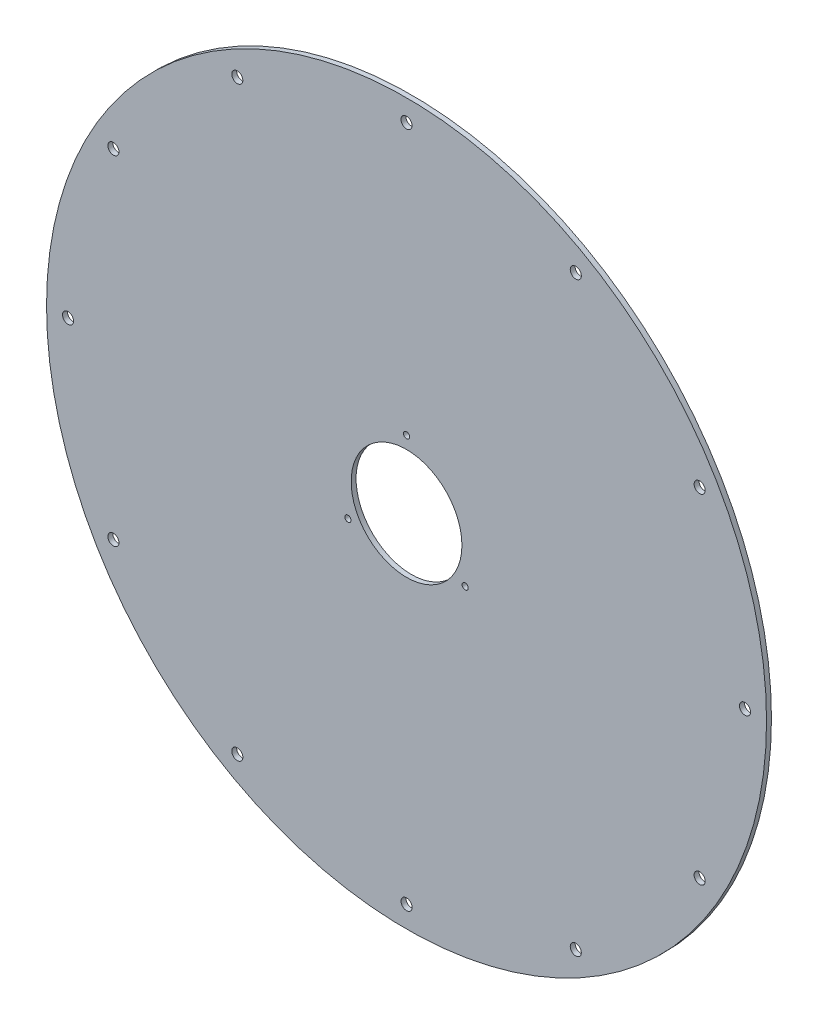
ISO-10303-21;
HEADER;
FILE_DESCRIPTION(('STEP AP214'),'2;1');
FILE_NAME('part.step','',(''),(''),'','','');
FILE_SCHEMA(('AUTOMOTIVE_DESIGN { 1 0 10303 214 1 1 1 1 }'));
ENDSEC;
DATA;
#1=APPLICATION_CONTEXT('core data for automotive mechanical design processes');
#2=APPLICATION_PROTOCOL_DEFINITION('international standard','automotive_design',2000,#1);
#3=PRODUCT_CONTEXT('',#1,'mechanical');
#4=PRODUCT('Part','Part','',(#3));
#5=PRODUCT_RELATED_PRODUCT_CATEGORY('part','',(#4));
#6=PRODUCT_DEFINITION_FORMATION('','',#4);
#7=PRODUCT_DEFINITION_CONTEXT('part definition',#1,'design');
#8=PRODUCT_DEFINITION('design','',#6,#7);
#9=PRODUCT_DEFINITION_SHAPE('','',#8);
#10=(LENGTH_UNIT() NAMED_UNIT(*) SI_UNIT(.MILLI.,.METRE.));
#11=(NAMED_UNIT(*) PLANE_ANGLE_UNIT() SI_UNIT($,.RADIAN.));
#12=(NAMED_UNIT(*) SI_UNIT($,.STERADIAN.) SOLID_ANGLE_UNIT());
#13=UNCERTAINTY_MEASURE_WITH_UNIT(LENGTH_MEASURE(1.E-05),#10,'distance_accuracy_value','');
#14=(GEOMETRIC_REPRESENTATION_CONTEXT(3) GLOBAL_UNCERTAINTY_ASSIGNED_CONTEXT((#13)) GLOBAL_UNIT_ASSIGNED_CONTEXT((#10,
#11,#12)) REPRESENTATION_CONTEXT('',''));
#15=CARTESIAN_POINT('',(0.,0.,0.));
#16=DIRECTION('',(0.,0.,1.));
#17=DIRECTION('',(1.,0.,0.));
#18=AXIS2_PLACEMENT_3D('',#15,#16,#17);
#19=CARTESIAN_POINT('',(0.,0.,0.));
#20=DIRECTION('',(0.,0.,1.));
#21=DIRECTION('',(1.,0.,0.));
#22=AXIS2_PLACEMENT_3D('',#19,#20,#21);
#23=PLANE('',#22);
#24=CARTESIAN_POINT('',(47.6313972081444,-27.4999999999996,0.));
#25=DIRECTION('',(0.,0.,-1.));
#26=DIRECTION('',(-1.,0.,0.));
#27=AXIS2_PLACEMENT_3D('',#24,#25,#26);
#28=CIRCLE('',#27,2.5);
#29=CARTESIAN_POINT('',(45.1313972081444,-27.4999999999996,0.));
#30=VERTEX_POINT('',#29);
#31=EDGE_CURVE('E148',#30,#30,#28,.T.);
#32=ORIENTED_EDGE('',*,*,#31,.F.);
#33=EDGE_LOOP('',(#32));
#34=FACE_BOUND('',#33,.T.);
#35=CARTESIAN_POINT('',(0.,55.,0.));
#36=DIRECTION('',(0.,0.,-1.));
#37=DIRECTION('',(-1.,0.,0.));
#38=AXIS2_PLACEMENT_3D('',#35,#36,#37);
#39=CIRCLE('',#38,2.5);
#40=CARTESIAN_POINT('',(-2.5,55.,0.));
#41=VERTEX_POINT('',#40);
#42=EDGE_CURVE('E136',#41,#41,#39,.T.);
#43=ORIENTED_EDGE('',*,*,#42,.F.);
#44=EDGE_LOOP('',(#43));
#45=FACE_BOUND('',#44,.T.);
#46=CARTESIAN_POINT('',(-238.156986040721,137.499999999999,0.));
#47=DIRECTION('',(0.,0.,1.));
#48=DIRECTION('',(0.499999999999998,0.86602540378444,0.));
#49=AXIS2_PLACEMENT_3D('',#46,#47,#48);
#50=CIRCLE('',#49,4.5);
#51=CARTESIAN_POINT('',(-235.906986040721,141.397114317029,0.));
#52=VERTEX_POINT('',#51);
#53=EDGE_CURVE('E71',#52,#52,#50,.T.);
#54=ORIENTED_EDGE('',*,*,#53,.T.);
#55=EDGE_LOOP('',(#54));
#56=FACE_BOUND('',#55,.T.);
#57=CARTESIAN_POINT('',(-275.,-9.60157368181862E-13,0.));
#58=DIRECTION('',(0.,0.,1.));
#59=DIRECTION('',(0.,1.,0.));
#60=AXIS2_PLACEMENT_3D('',#57,#58,#59);
#61=CIRCLE('',#60,4.5);
#62=CARTESIAN_POINT('',(-275.,4.49999999999904,0.));
#63=VERTEX_POINT('',#62);
#64=EDGE_CURVE('E114',#63,#63,#61,.T.);
#65=ORIENTED_EDGE('',*,*,#64,.T.);
#66=EDGE_LOOP('',(#65));
#67=FACE_BOUND('',#66,.T.);
#68=CARTESIAN_POINT('',(-238.15698604072,-137.500000000001,0.));
#69=DIRECTION('',(0.,0.,1.));
#70=DIRECTION('',(-0.500000000000004,0.866025403784436,0.));
#71=AXIS2_PLACEMENT_3D('',#68,#69,#70);
#72=CIRCLE('',#71,4.5);
#73=CARTESIAN_POINT('',(-240.40698604072,-133.602885682971,0.));
#74=VERTEX_POINT('',#73);
#75=EDGE_CURVE('E108',#74,#74,#72,.T.);
#76=ORIENTED_EDGE('',*,*,#75,.T.);
#77=EDGE_LOOP('',(#76));
#78=FACE_BOUND('',#77,.T.);
#79=CARTESIAN_POINT('',(-137.499999999999,-238.156986040721,0.));
#80=DIRECTION('',(0.,0.,1.));
#81=DIRECTION('',(-0.866025403784442,0.499999999999995,0.));
#82=AXIS2_PLACEMENT_3D('',#79,#80,#81);
#83=CIRCLE('',#82,4.5);
#84=CARTESIAN_POINT('',(-141.397114317029,-235.906986040722,0.));
#85=VERTEX_POINT('',#84);
#86=EDGE_CURVE('E102',#85,#85,#83,.T.);
#87=ORIENTED_EDGE('',*,*,#86,.T.);
#88=EDGE_LOOP('',(#87));
#89=FACE_BOUND('',#88,.T.);
#90=CARTESIAN_POINT('',(0.,-275.,0.));
#91=DIRECTION('',(0.,0.,1.));
#92=DIRECTION('',(-1.,0.,0.));
#93=AXIS2_PLACEMENT_3D('',#90,#91,#92);
#94=CIRCLE('',#93,4.5);
#95=CARTESIAN_POINT('',(-4.5,-275.,0.));
#96=VERTEX_POINT('',#95);
#97=EDGE_CURVE('E96',#96,#96,#94,.T.);
#98=ORIENTED_EDGE('',*,*,#97,.T.);
#99=EDGE_LOOP('',(#98));
#100=FACE_BOUND('',#99,.T.);
#101=CARTESIAN_POINT('',(137.500000000002,-238.15698604072,0.));
#102=DIRECTION('',(0.,0.,1.));
#103=DIRECTION('',(-0.866025403784435,-0.500000000000007,0.));
#104=AXIS2_PLACEMENT_3D('',#101,#102,#103);
#105=CIRCLE('',#104,4.5);
#106=CARTESIAN_POINT('',(133.602885682972,-240.40698604072,0.));
#107=VERTEX_POINT('',#106);
#108=EDGE_CURVE('E90',#107,#107,#105,.T.);
#109=ORIENTED_EDGE('',*,*,#108,.T.);
#110=EDGE_LOOP('',(#109));
#111=FACE_BOUND('',#110,.T.);
#112=CARTESIAN_POINT('',(238.156986040722,-137.499999999998,0.));
#113=DIRECTION('',(0.,0.,1.));
#114=DIRECTION('',(-0.499999999999992,-0.866025403784443,0.));
#115=AXIS2_PLACEMENT_3D('',#112,#113,#114);
#116=CIRCLE('',#115,4.5);
#117=CARTESIAN_POINT('',(235.906986040722,-141.397114317028,0.));
#118=VERTEX_POINT('',#117);
#119=EDGE_CURVE('E84',#118,#118,#116,.T.);
#120=ORIENTED_EDGE('',*,*,#119,.T.);
#121=EDGE_LOOP('',(#120));
#122=FACE_BOUND('',#121,.T.);
#123=CARTESIAN_POINT('',(275.,2.88047210454559E-12,0.));
#124=DIRECTION('',(0.,0.,1.));
#125=DIRECTION('',(0.,-1.,0.));
#126=AXIS2_PLACEMENT_3D('',#123,#124,#125);
#127=CIRCLE('',#126,4.5);
#128=CARTESIAN_POINT('',(275.,-4.49999999999712,0.));
#129=VERTEX_POINT('',#128);
#130=EDGE_CURVE('E77',#129,#129,#127,.T.);
#131=ORIENTED_EDGE('',*,*,#130,.T.);
#132=EDGE_LOOP('',(#131));
#133=FACE_BOUND('',#132,.T.);
#134=CARTESIAN_POINT('',(238.156986040719,137.500000000003,0.));
#135=DIRECTION('',(0.,0.,1.));
#136=DIRECTION('',(0.50000000000001,-0.866025403784433,0.));
#137=AXIS2_PLACEMENT_3D('',#134,#135,#136);
#138=CIRCLE('',#137,4.5);
#139=CARTESIAN_POINT('',(240.406986040719,133.602885682973,0.));
#140=VERTEX_POINT('',#139);
#141=EDGE_CURVE('E78',#140,#140,#138,.T.);
#142=ORIENTED_EDGE('',*,*,#141,.T.);
#143=EDGE_LOOP('',(#142));
#144=FACE_BOUND('',#143,.T.);
#145=CARTESIAN_POINT('',(137.499999999997,238.156986040722,0.));
#146=DIRECTION('',(0.,0.,1.));
#147=DIRECTION('',(0.866025403784445,-0.499999999999989,0.));
#148=AXIS2_PLACEMENT_3D('',#145,#146,#147);
#149=CIRCLE('',#148,4.5);
#150=CARTESIAN_POINT('',(141.397114317027,235.906986040722,0.));
#151=VERTEX_POINT('',#150);
#152=EDGE_CURVE('E125',#151,#151,#149,.T.);
#153=ORIENTED_EDGE('',*,*,#152,.T.);
#154=EDGE_LOOP('',(#153));
#155=FACE_BOUND('',#154,.T.);
#156=CARTESIAN_POINT('',(-137.5,238.15698604072,0.));
#157=DIRECTION('',(0.,0.,1.));
#158=DIRECTION('',(0.866025403784438,0.500000000000001,0.));
#159=AXIS2_PLACEMENT_3D('',#156,#157,#158);
#160=CIRCLE('',#159,4.5);
#161=CARTESIAN_POINT('',(-133.60288568297,240.40698604072,0.));
#162=VERTEX_POINT('',#161);
#163=EDGE_CURVE('E65',#162,#162,#160,.T.);
#164=ORIENTED_EDGE('',*,*,#163,.T.);
#165=EDGE_LOOP('',(#164));
#166=FACE_BOUND('',#165,.T.);
#167=CARTESIAN_POINT('',(0.,275.,0.));
#168=DIRECTION('',(0.,0.,1.));
#169=DIRECTION('',(1.,0.,0.));
#170=AXIS2_PLACEMENT_3D('',#167,#168,#169);
#171=CIRCLE('',#170,4.5);
#172=CARTESIAN_POINT('',(4.5,275.,0.));
#173=VERTEX_POINT('',#172);
#174=EDGE_CURVE('E59',#173,#173,#171,.T.);
#175=ORIENTED_EDGE('',*,*,#174,.T.);
#176=EDGE_LOOP('',(#175));
#177=FACE_BOUND('',#176,.T.);
#178=CARTESIAN_POINT('',(0.,0.,0.));
#179=DIRECTION('',(0.,0.,1.));
#180=DIRECTION('',(1.,0.,0.));
#181=AXIS2_PLACEMENT_3D('',#178,#179,#180);
#182=CIRCLE('',#181,292.5);
#183=CARTESIAN_POINT('',(292.5,0.,0.));
#184=VERTEX_POINT('',#183);
#185=EDGE_CURVE('E47',#184,#184,#182,.T.);
#186=ORIENTED_EDGE('',*,*,#185,.F.);
#187=EDGE_LOOP('',(#186));
#188=FACE_BOUND('',#187,.T.);
#189=CARTESIAN_POINT('',(0.,0.,0.));
#190=DIRECTION('',(0.,0.,1.));
#191=DIRECTION('',(1.,0.,0.));
#192=AXIS2_PLACEMENT_3D('',#189,#190,#191);
#193=CIRCLE('',#192,45.);
#194=CARTESIAN_POINT('',(45.,0.,0.));
#195=VERTEX_POINT('',#194);
#196=EDGE_CURVE('E56',#195,#195,#193,.T.);
#197=ORIENTED_EDGE('',*,*,#196,.T.);
#198=EDGE_LOOP('',(#197));
#199=FACE_BOUND('',#198,.T.);
#200=CARTESIAN_POINT('',(-47.631397208144,-27.5000000000002,0.));
#201=DIRECTION('',(0.,0.,-1.));
#202=DIRECTION('',(-1.,0.,0.));
#203=AXIS2_PLACEMENT_3D('',#200,#201,#202);
#204=CIRCLE('',#203,2.5);
#205=CARTESIAN_POINT('',(-50.131397208144,-27.5000000000002,0.));
#206=VERTEX_POINT('',#205);
#207=EDGE_CURVE('E142',#206,#206,#204,.T.);
#208=ORIENTED_EDGE('',*,*,#207,.F.);
#209=EDGE_LOOP('',(#208));
#210=FACE_BOUND('',#209,.T.);
#211=ADVANCED_FACE('F43',(#34,#45,#56,#67,#78,#89,#100,#111,#122,#133,#144,#155,#166,#177,#188,
#199,#210),#23,.F.);
#212=CARTESIAN_POINT('',(0.,0.,4.));
#213=DIRECTION('',(0.,0.,1.));
#214=DIRECTION('',(1.,0.,0.));
#215=AXIS2_PLACEMENT_3D('',#212,#213,#214);
#216=PLANE('',#215);
#217=CARTESIAN_POINT('',(47.6313972081444,-27.4999999999996,4.));
#218=DIRECTION('',(0.,0.,1.));
#219=DIRECTION('',(1.,0.,0.));
#220=AXIS2_PLACEMENT_3D('',#217,#218,#219);
#221=CIRCLE('',#220,2.5);
#222=CARTESIAN_POINT('',(50.1313972081444,-27.4999999999996,4.));
#223=VERTEX_POINT('',#222);
#224=EDGE_CURVE('E145',#223,#223,#221,.T.);
#225=ORIENTED_EDGE('',*,*,#224,.F.);
#226=EDGE_LOOP('',(#225));
#227=FACE_BOUND('',#226,.T.);
#228=CARTESIAN_POINT('',(-47.631397208144,-27.5000000000002,4.));
#229=DIRECTION('',(0.,0.,1.));
#230=DIRECTION('',(1.,0.,0.));
#231=AXIS2_PLACEMENT_3D('',#228,#229,#230);
#232=CIRCLE('',#231,2.5);
#233=CARTESIAN_POINT('',(-45.131397208144,-27.5000000000002,4.));
#234=VERTEX_POINT('',#233);
#235=EDGE_CURVE('E139',#234,#234,#232,.T.);
#236=ORIENTED_EDGE('',*,*,#235,.F.);
#237=EDGE_LOOP('',(#236));
#238=FACE_BOUND('',#237,.T.);
#239=CARTESIAN_POINT('',(0.,55.,4.));
#240=DIRECTION('',(0.,0.,1.));
#241=DIRECTION('',(1.,0.,0.));
#242=AXIS2_PLACEMENT_3D('',#239,#240,#241);
#243=CIRCLE('',#242,2.5);
#244=CARTESIAN_POINT('',(2.5,55.,4.));
#245=VERTEX_POINT('',#244);
#246=EDGE_CURVE('E126',#245,#245,#243,.T.);
#247=ORIENTED_EDGE('',*,*,#246,.F.);
#248=EDGE_LOOP('',(#247));
#249=FACE_BOUND('',#248,.T.);
#250=CARTESIAN_POINT('',(-238.156986040721,137.499999999999,4.));
#251=DIRECTION('',(0.,0.,1.));
#252=DIRECTION('',(0.499999999999998,0.86602540378444,0.));
#253=AXIS2_PLACEMENT_3D('',#250,#251,#252);
#254=CIRCLE('',#253,4.5);
#255=CARTESIAN_POINT('',(-235.906986040721,141.397114317029,4.));
#256=VERTEX_POINT('',#255);
#257=EDGE_CURVE('E117',#256,#256,#254,.T.);
#258=ORIENTED_EDGE('',*,*,#257,.F.);
#259=EDGE_LOOP('',(#258));
#260=FACE_BOUND('',#259,.T.);
#261=CARTESIAN_POINT('',(-275.,-9.60157368181862E-13,4.));
#262=DIRECTION('',(0.,0.,1.));
#263=DIRECTION('',(0.,1.,0.));
#264=AXIS2_PLACEMENT_3D('',#261,#262,#263);
#265=CIRCLE('',#264,4.5);
#266=CARTESIAN_POINT('',(-275.,4.49999999999904,4.));
#267=VERTEX_POINT('',#266);
#268=EDGE_CURVE('E111',#267,#267,#265,.T.);
#269=ORIENTED_EDGE('',*,*,#268,.F.);
#270=EDGE_LOOP('',(#269));
#271=FACE_BOUND('',#270,.T.);
#272=CARTESIAN_POINT('',(-238.15698604072,-137.500000000001,4.));
#273=DIRECTION('',(0.,0.,1.));
#274=DIRECTION('',(-0.500000000000004,0.866025403784436,0.));
#275=AXIS2_PLACEMENT_3D('',#272,#273,#274);
#276=CIRCLE('',#275,4.5);
#277=CARTESIAN_POINT('',(-240.40698604072,-133.602885682971,4.));
#278=VERTEX_POINT('',#277);
#279=EDGE_CURVE('E105',#278,#278,#276,.T.);
#280=ORIENTED_EDGE('',*,*,#279,.F.);
#281=EDGE_LOOP('',(#280));
#282=FACE_BOUND('',#281,.T.);
#283=CARTESIAN_POINT('',(-137.499999999999,-238.156986040721,4.));
#284=DIRECTION('',(0.,0.,1.));
#285=DIRECTION('',(-0.866025403784442,0.499999999999995,0.));
#286=AXIS2_PLACEMENT_3D('',#283,#284,#285);
#287=CIRCLE('',#286,4.5);
#288=CARTESIAN_POINT('',(-141.397114317029,-235.906986040722,4.));
#289=VERTEX_POINT('',#288);
#290=EDGE_CURVE('E99',#289,#289,#287,.T.);
#291=ORIENTED_EDGE('',*,*,#290,.F.);
#292=EDGE_LOOP('',(#291));
#293=FACE_BOUND('',#292,.T.);
#294=CARTESIAN_POINT('',(0.,-275.,4.));
#295=DIRECTION('',(0.,0.,1.));
#296=DIRECTION('',(-1.,0.,0.));
#297=AXIS2_PLACEMENT_3D('',#294,#295,#296);
#298=CIRCLE('',#297,4.5);
#299=CARTESIAN_POINT('',(-4.5,-275.,4.));
#300=VERTEX_POINT('',#299);
#301=EDGE_CURVE('E93',#300,#300,#298,.T.);
#302=ORIENTED_EDGE('',*,*,#301,.F.);
#303=EDGE_LOOP('',(#302));
#304=FACE_BOUND('',#303,.T.);
#305=CARTESIAN_POINT('',(137.500000000002,-238.15698604072,4.));
#306=DIRECTION('',(0.,0.,1.));
#307=DIRECTION('',(-0.866025403784435,-0.500000000000007,0.));
#308=AXIS2_PLACEMENT_3D('',#305,#306,#307);
#309=CIRCLE('',#308,4.5);
#310=CARTESIAN_POINT('',(133.602885682972,-240.40698604072,4.));
#311=VERTEX_POINT('',#310);
#312=EDGE_CURVE('E87',#311,#311,#309,.T.);
#313=ORIENTED_EDGE('',*,*,#312,.F.);
#314=EDGE_LOOP('',(#313));
#315=FACE_BOUND('',#314,.T.);
#316=CARTESIAN_POINT('',(238.156986040722,-137.499999999998,4.));
#317=DIRECTION('',(0.,0.,1.));
#318=DIRECTION('',(-0.499999999999992,-0.866025403784443,0.));
#319=AXIS2_PLACEMENT_3D('',#316,#317,#318);
#320=CIRCLE('',#319,4.5);
#321=CARTESIAN_POINT('',(235.906986040722,-141.397114317028,4.));
#322=VERTEX_POINT('',#321);
#323=EDGE_CURVE('E81',#322,#322,#320,.T.);
#324=ORIENTED_EDGE('',*,*,#323,.F.);
#325=EDGE_LOOP('',(#324));
#326=FACE_BOUND('',#325,.T.);
#327=CARTESIAN_POINT('',(275.,2.88047210454559E-12,4.));
#328=DIRECTION('',(0.,0.,1.));
#329=DIRECTION('',(0.,-1.,0.));
#330=AXIS2_PLACEMENT_3D('',#327,#328,#329);
#331=CIRCLE('',#330,4.5);
#332=CARTESIAN_POINT('',(275.,-4.49999999999712,4.));
#333=VERTEX_POINT('',#332);
#334=EDGE_CURVE('E74',#333,#333,#331,.T.);
#335=ORIENTED_EDGE('',*,*,#334,.F.);
#336=EDGE_LOOP('',(#335));
#337=FACE_BOUND('',#336,.T.);
#338=CARTESIAN_POINT('',(238.156986040719,137.500000000003,4.));
#339=DIRECTION('',(0.,0.,1.));
#340=DIRECTION('',(0.50000000000001,-0.866025403784433,0.));
#341=AXIS2_PLACEMENT_3D('',#338,#339,#340);
#342=CIRCLE('',#341,4.5);
#343=CARTESIAN_POINT('',(240.406986040719,133.602885682973,4.));
#344=VERTEX_POINT('',#343);
#345=EDGE_CURVE('E129',#344,#344,#342,.T.);
#346=ORIENTED_EDGE('',*,*,#345,.F.);
#347=EDGE_LOOP('',(#346));
#348=FACE_BOUND('',#347,.T.);
#349=CARTESIAN_POINT('',(137.499999999997,238.156986040722,4.));
#350=DIRECTION('',(0.,0.,1.));
#351=DIRECTION('',(0.866025403784445,-0.499999999999989,0.));
#352=AXIS2_PLACEMENT_3D('',#349,#350,#351);
#353=CIRCLE('',#352,4.5);
#354=CARTESIAN_POINT('',(141.397114317027,235.906986040722,4.));
#355=VERTEX_POINT('',#354);
#356=EDGE_CURVE('E122',#355,#355,#353,.T.);
#357=ORIENTED_EDGE('',*,*,#356,.F.);
#358=EDGE_LOOP('',(#357));
#359=FACE_BOUND('',#358,.T.);
#360=CARTESIAN_POINT('',(-137.5,238.15698604072,4.));
#361=DIRECTION('',(0.,0.,1.));
#362=DIRECTION('',(0.866025403784438,0.500000000000001,0.));
#363=AXIS2_PLACEMENT_3D('',#360,#361,#362);
#364=CIRCLE('',#363,4.5);
#365=CARTESIAN_POINT('',(-133.60288568297,240.40698604072,4.));
#366=VERTEX_POINT('',#365);
#367=EDGE_CURVE('E68',#366,#366,#364,.T.);
#368=ORIENTED_EDGE('',*,*,#367,.F.);
#369=EDGE_LOOP('',(#368));
#370=FACE_BOUND('',#369,.T.);
#371=CARTESIAN_POINT('',(0.,275.,4.));
#372=DIRECTION('',(0.,0.,1.));
#373=DIRECTION('',(1.,0.,0.));
#374=AXIS2_PLACEMENT_3D('',#371,#372,#373);
#375=CIRCLE('',#374,4.5);
#376=CARTESIAN_POINT('',(4.5,275.,4.));
#377=VERTEX_POINT('',#376);
#378=EDGE_CURVE('E62',#377,#377,#375,.T.);
#379=ORIENTED_EDGE('',*,*,#378,.F.);
#380=EDGE_LOOP('',(#379));
#381=FACE_BOUND('',#380,.T.);
#382=CARTESIAN_POINT('',(0.,0.,4.));
#383=DIRECTION('',(0.,0.,1.));
#384=DIRECTION('',(1.,0.,0.));
#385=AXIS2_PLACEMENT_3D('',#382,#383,#384);
#386=CIRCLE('',#385,292.5);
#387=CARTESIAN_POINT('',(292.5,0.,4.));
#388=VERTEX_POINT('',#387);
#389=EDGE_CURVE('E10',#388,#388,#386,.T.);
#390=ORIENTED_EDGE('',*,*,#389,.T.);
#391=EDGE_LOOP('',(#390));
#392=FACE_BOUND('',#391,.T.);
#393=CARTESIAN_POINT('',(0.,0.,4.));
#394=DIRECTION('',(0.,0.,1.));
#395=DIRECTION('',(1.,0.,0.));
#396=AXIS2_PLACEMENT_3D('',#393,#394,#395);
#397=CIRCLE('',#396,45.);
#398=CARTESIAN_POINT('',(45.,0.,4.));
#399=VERTEX_POINT('',#398);
#400=EDGE_CURVE('E54',#399,#399,#397,.T.);
#401=ORIENTED_EDGE('',*,*,#400,.F.);
#402=EDGE_LOOP('',(#401));
#403=FACE_BOUND('',#402,.T.);
#404=ADVANCED_FACE('F156',(#227,#238,#249,#260,#271,#282,#293,#304,#315,#326,#337,#348,#359,
#370,#381,#392,#403),#216,.T.);
#405=CARTESIAN_POINT('',(0.,0.,4.));
#406=DIRECTION('',(0.,0.,-1.));
#407=DIRECTION('',(-1.,0.,0.));
#408=AXIS2_PLACEMENT_3D('',#405,#406,#407);
#409=CYLINDRICAL_SURFACE('',#408,292.5);
#410=ORIENTED_EDGE('',*,*,#389,.F.);
#411=EDGE_LOOP('',(#410));
#412=FACE_BOUND('',#411,.T.);
#413=ORIENTED_EDGE('',*,*,#185,.T.);
#414=EDGE_LOOP('',(#413));
#415=FACE_BOUND('',#414,.T.);
#416=ADVANCED_FACE('F45',(#412,#415),#409,.T.);
#417=CARTESIAN_POINT('',(0.,0.,4.));
#418=DIRECTION('',(0.,0.,-1.));
#419=DIRECTION('',(-1.,0.,0.));
#420=AXIS2_PLACEMENT_3D('',#417,#418,#419);
#421=CYLINDRICAL_SURFACE('',#420,45.);
#422=ORIENTED_EDGE('',*,*,#400,.T.);
#423=EDGE_LOOP('',(#422));
#424=FACE_BOUND('',#423,.T.);
#425=ORIENTED_EDGE('',*,*,#196,.F.);
#426=EDGE_LOOP('',(#425));
#427=FACE_BOUND('',#426,.T.);
#428=ADVANCED_FACE('F250',(#424,#427),#421,.F.);
#429=CARTESIAN_POINT('',(0.,275.,0.));
#430=DIRECTION('',(0.,0.,1.));
#431=DIRECTION('',(1.,0.,0.));
#432=AXIS2_PLACEMENT_3D('',#429,#430,#431);
#433=CYLINDRICAL_SURFACE('',#432,4.5);
#434=ORIENTED_EDGE('',*,*,#174,.F.);
#435=EDGE_LOOP('',(#434));
#436=FACE_BOUND('',#435,.T.);
#437=ORIENTED_EDGE('',*,*,#378,.T.);
#438=EDGE_LOOP('',(#437));
#439=FACE_BOUND('',#438,.T.);
#440=ADVANCED_FACE('F246',(#436,#439),#433,.F.);
#441=CARTESIAN_POINT('',(-137.5,238.15698604072,0.));
#442=DIRECTION('',(0.,0.,1.));
#443=DIRECTION('',(1.,0.,0.));
#444=AXIS2_PLACEMENT_3D('',#441,#442,#443);
#445=CYLINDRICAL_SURFACE('',#444,4.5);
#446=ORIENTED_EDGE('',*,*,#163,.F.);
#447=EDGE_LOOP('',(#446));
#448=FACE_BOUND('',#447,.T.);
#449=ORIENTED_EDGE('',*,*,#367,.T.);
#450=EDGE_LOOP('',(#449));
#451=FACE_BOUND('',#450,.T.);
#452=ADVANCED_FACE('F212',(#448,#451),#445,.F.);
#453=CARTESIAN_POINT('',(137.499999999997,238.156986040722,0.));
#454=DIRECTION('',(0.,0.,1.));
#455=DIRECTION('',(1.,0.,0.));
#456=AXIS2_PLACEMENT_3D('',#453,#454,#455);
#457=CYLINDRICAL_SURFACE('',#456,4.5);
#458=ORIENTED_EDGE('',*,*,#152,.F.);
#459=EDGE_LOOP('',(#458));
#460=FACE_BOUND('',#459,.T.);
#461=ORIENTED_EDGE('',*,*,#356,.T.);
#462=EDGE_LOOP('',(#461));
#463=FACE_BOUND('',#462,.T.);
#464=ADVANCED_FACE('F208',(#460,#463),#457,.F.);
#465=CARTESIAN_POINT('',(238.156986040719,137.500000000003,0.));
#466=DIRECTION('',(0.,0.,1.));
#467=DIRECTION('',(1.,0.,0.));
#468=AXIS2_PLACEMENT_3D('',#465,#466,#467);
#469=CYLINDRICAL_SURFACE('',#468,4.5);
#470=ORIENTED_EDGE('',*,*,#141,.F.);
#471=EDGE_LOOP('',(#470));
#472=FACE_BOUND('',#471,.T.);
#473=ORIENTED_EDGE('',*,*,#345,.T.);
#474=EDGE_LOOP('',(#473));
#475=FACE_BOUND('',#474,.T.);
#476=ADVANCED_FACE('F204',(#472,#475),#469,.F.);
#477=CARTESIAN_POINT('',(275.,2.88047210454559E-12,0.));
#478=DIRECTION('',(0.,0.,1.));
#479=DIRECTION('',(1.,0.,0.));
#480=AXIS2_PLACEMENT_3D('',#477,#478,#479);
#481=CYLINDRICAL_SURFACE('',#480,4.5);
#482=ORIENTED_EDGE('',*,*,#130,.F.);
#483=EDGE_LOOP('',(#482));
#484=FACE_BOUND('',#483,.T.);
#485=ORIENTED_EDGE('',*,*,#334,.T.);
#486=EDGE_LOOP('',(#485));
#487=FACE_BOUND('',#486,.T.);
#488=ADVANCED_FACE('F207',(#484,#487),#481,.F.);
#489=CARTESIAN_POINT('',(238.156986040722,-137.499999999998,0.));
#490=DIRECTION('',(0.,0.,1.));
#491=DIRECTION('',(1.,0.,0.));
#492=AXIS2_PLACEMENT_3D('',#489,#490,#491);
#493=CYLINDRICAL_SURFACE('',#492,4.5);
#494=ORIENTED_EDGE('',*,*,#119,.F.);
#495=EDGE_LOOP('',(#494));
#496=FACE_BOUND('',#495,.T.);
#497=ORIENTED_EDGE('',*,*,#323,.T.);
#498=EDGE_LOOP('',(#497));
#499=FACE_BOUND('',#498,.T.);
#500=ADVANCED_FACE('F236',(#496,#499),#493,.F.);
#501=CARTESIAN_POINT('',(137.500000000002,-238.15698604072,0.));
#502=DIRECTION('',(0.,0.,1.));
#503=DIRECTION('',(1.,0.,0.));
#504=AXIS2_PLACEMENT_3D('',#501,#502,#503);
#505=CYLINDRICAL_SURFACE('',#504,4.5);
#506=ORIENTED_EDGE('',*,*,#108,.F.);
#507=EDGE_LOOP('',(#506));
#508=FACE_BOUND('',#507,.T.);
#509=ORIENTED_EDGE('',*,*,#312,.T.);
#510=EDGE_LOOP('',(#509));
#511=FACE_BOUND('',#510,.T.);
#512=ADVANCED_FACE('F232',(#508,#511),#505,.F.);
#513=CARTESIAN_POINT('',(0.,-275.,0.));
#514=DIRECTION('',(0.,0.,1.));
#515=DIRECTION('',(1.,0.,0.));
#516=AXIS2_PLACEMENT_3D('',#513,#514,#515);
#517=CYLINDRICAL_SURFACE('',#516,4.5);
#518=ORIENTED_EDGE('',*,*,#97,.F.);
#519=EDGE_LOOP('',(#518));
#520=FACE_BOUND('',#519,.T.);
#521=ORIENTED_EDGE('',*,*,#301,.T.);
#522=EDGE_LOOP('',(#521));
#523=FACE_BOUND('',#522,.T.);
#524=ADVANCED_FACE('F228',(#520,#523),#517,.F.);
#525=CARTESIAN_POINT('',(-137.499999999999,-238.156986040721,0.));
#526=DIRECTION('',(0.,0.,1.));
#527=DIRECTION('',(1.,0.,0.));
#528=AXIS2_PLACEMENT_3D('',#525,#526,#527);
#529=CYLINDRICAL_SURFACE('',#528,4.5);
#530=ORIENTED_EDGE('',*,*,#86,.F.);
#531=EDGE_LOOP('',(#530));
#532=FACE_BOUND('',#531,.T.);
#533=ORIENTED_EDGE('',*,*,#290,.T.);
#534=EDGE_LOOP('',(#533));
#535=FACE_BOUND('',#534,.T.);
#536=ADVANCED_FACE('F224',(#532,#535),#529,.F.);
#537=CARTESIAN_POINT('',(-238.15698604072,-137.500000000001,0.));
#538=DIRECTION('',(0.,0.,1.));
#539=DIRECTION('',(1.,0.,0.));
#540=AXIS2_PLACEMENT_3D('',#537,#538,#539);
#541=CYLINDRICAL_SURFACE('',#540,4.5);
#542=ORIENTED_EDGE('',*,*,#75,.F.);
#543=EDGE_LOOP('',(#542));
#544=FACE_BOUND('',#543,.T.);
#545=ORIENTED_EDGE('',*,*,#279,.T.);
#546=EDGE_LOOP('',(#545));
#547=FACE_BOUND('',#546,.T.);
#548=ADVANCED_FACE('F220',(#544,#547),#541,.F.);
#549=CARTESIAN_POINT('',(-275.,-9.60157368181862E-13,0.));
#550=DIRECTION('',(0.,0.,1.));
#551=DIRECTION('',(1.,0.,0.));
#552=AXIS2_PLACEMENT_3D('',#549,#550,#551);
#553=CYLINDRICAL_SURFACE('',#552,4.5);
#554=ORIENTED_EDGE('',*,*,#64,.F.);
#555=EDGE_LOOP('',(#554));
#556=FACE_BOUND('',#555,.T.);
#557=ORIENTED_EDGE('',*,*,#268,.T.);
#558=EDGE_LOOP('',(#557));
#559=FACE_BOUND('',#558,.T.);
#560=ADVANCED_FACE('F216',(#556,#559),#553,.F.);
#561=CARTESIAN_POINT('',(-238.156986040721,137.499999999999,0.));
#562=DIRECTION('',(0.,0.,1.));
#563=DIRECTION('',(1.,0.,0.));
#564=AXIS2_PLACEMENT_3D('',#561,#562,#563);
#565=CYLINDRICAL_SURFACE('',#564,4.5);
#566=ORIENTED_EDGE('',*,*,#53,.F.);
#567=EDGE_LOOP('',(#566));
#568=FACE_BOUND('',#567,.T.);
#569=ORIENTED_EDGE('',*,*,#257,.T.);
#570=EDGE_LOOP('',(#569));
#571=FACE_BOUND('',#570,.T.);
#572=ADVANCED_FACE('F200',(#568,#571),#565,.F.);
#573=CARTESIAN_POINT('',(0.,55.,0.));
#574=DIRECTION('',(0.,0.,-1.));
#575=DIRECTION('',(-1.,0.,0.));
#576=AXIS2_PLACEMENT_3D('',#573,#574,#575);
#577=CYLINDRICAL_SURFACE('',#576,2.5);
#578=ORIENTED_EDGE('',*,*,#246,.T.);
#579=EDGE_LOOP('',(#578));
#580=FACE_BOUND('',#579,.T.);
#581=ORIENTED_EDGE('',*,*,#42,.T.);
#582=EDGE_LOOP('',(#581));
#583=FACE_BOUND('',#582,.T.);
#584=ADVANCED_FACE('F191',(#580,#583),#577,.F.);
#585=CARTESIAN_POINT('',(-47.631397208144,-27.5000000000002,0.));
#586=DIRECTION('',(0.,0.,-1.));
#587=DIRECTION('',(-1.,0.,0.));
#588=AXIS2_PLACEMENT_3D('',#585,#586,#587);
#589=CYLINDRICAL_SURFACE('',#588,2.5);
#590=ORIENTED_EDGE('',*,*,#235,.T.);
#591=EDGE_LOOP('',(#590));
#592=FACE_BOUND('',#591,.T.);
#593=ORIENTED_EDGE('',*,*,#207,.T.);
#594=EDGE_LOOP('',(#593));
#595=FACE_BOUND('',#594,.T.);
#596=ADVANCED_FACE('F189',(#592,#595),#589,.F.);
#597=CARTESIAN_POINT('',(47.6313972081444,-27.4999999999996,0.));
#598=DIRECTION('',(0.,0.,-1.));
#599=DIRECTION('',(-1.,0.,0.));
#600=AXIS2_PLACEMENT_3D('',#597,#598,#599);
#601=CYLINDRICAL_SURFACE('',#600,2.5);
#602=ORIENTED_EDGE('',*,*,#224,.T.);
#603=EDGE_LOOP('',(#602));
#604=FACE_BOUND('',#603,.T.);
#605=ORIENTED_EDGE('',*,*,#31,.T.);
#606=EDGE_LOOP('',(#605));
#607=FACE_BOUND('',#606,.T.);
#608=ADVANCED_FACE('F152',(#604,#607),#601,.F.);
#609=CLOSED_SHELL('',(#211,#404,#416,#428,#440,#452,#464,#476,#488,#500,#512,#524,#536,#548,
#560,#572,#584,#596,#608));
#610=MANIFOLD_SOLID_BREP('B2',#609);
#611=ADVANCED_BREP_SHAPE_REPRESENTATION('',(#18,#610),#14);
#612=SHAPE_DEFINITION_REPRESENTATION(#9,#611);
ENDSEC;
END-ISO-10303-21;
